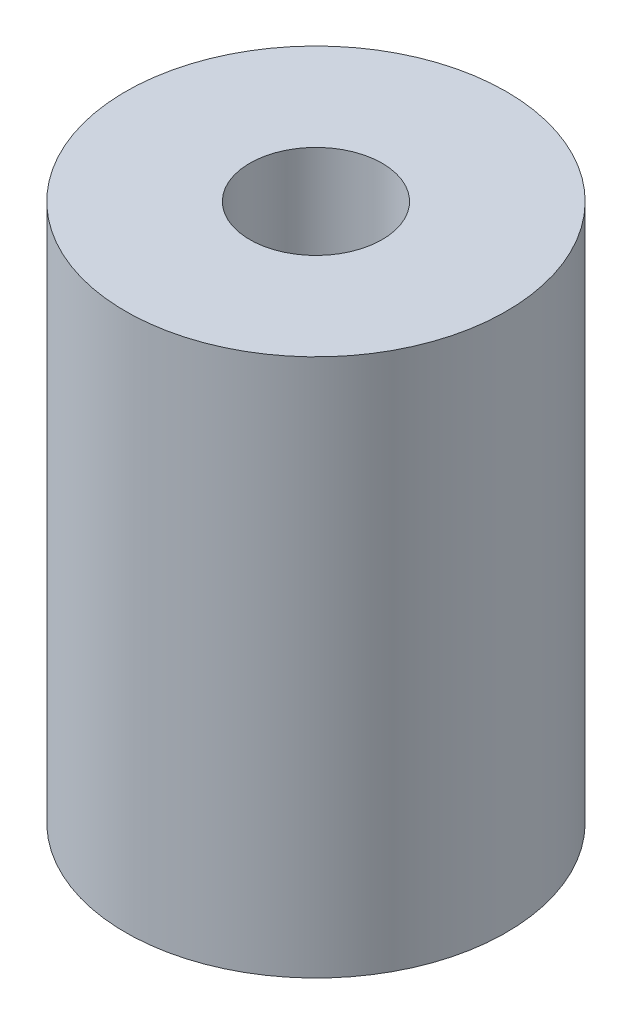
ISO-10303-21;
HEADER;
FILE_DESCRIPTION(('STEP AP214'),'2;1');
FILE_NAME('part.step','',(''),(''),'','','');
FILE_SCHEMA(('AUTOMOTIVE_DESIGN { 1 0 10303 214 1 1 1 1 }'));
ENDSEC;
DATA;
#1=APPLICATION_CONTEXT('core data for automotive mechanical design processes');
#2=APPLICATION_PROTOCOL_DEFINITION('international standard','automotive_design',2000,#1);
#3=PRODUCT_CONTEXT('',#1,'mechanical');
#4=PRODUCT('Part','Part','',(#3));
#5=PRODUCT_RELATED_PRODUCT_CATEGORY('part','',(#4));
#6=PRODUCT_DEFINITION_FORMATION('','',#4);
#7=PRODUCT_DEFINITION_CONTEXT('part definition',#1,'design');
#8=PRODUCT_DEFINITION('design','',#6,#7);
#9=PRODUCT_DEFINITION_SHAPE('','',#8);
#10=(LENGTH_UNIT() NAMED_UNIT(*) SI_UNIT(.MILLI.,.METRE.));
#11=(NAMED_UNIT(*) PLANE_ANGLE_UNIT() SI_UNIT($,.RADIAN.));
#12=(NAMED_UNIT(*) SI_UNIT($,.STERADIAN.) SOLID_ANGLE_UNIT());
#13=UNCERTAINTY_MEASURE_WITH_UNIT(LENGTH_MEASURE(1.E-05),#10,'distance_accuracy_value','');
#14=(GEOMETRIC_REPRESENTATION_CONTEXT(3) GLOBAL_UNCERTAINTY_ASSIGNED_CONTEXT((#13)) GLOBAL_UNIT_ASSIGNED_CONTEXT((#10,
#11,#12)) REPRESENTATION_CONTEXT('',''));
#15=CARTESIAN_POINT('',(0.,0.,0.));
#16=DIRECTION('',(0.,0.,1.));
#17=DIRECTION('',(1.,0.,0.));
#18=AXIS2_PLACEMENT_3D('',#15,#16,#17);
#19=CARTESIAN_POINT('',(0.,13.,0.));
#20=DIRECTION('',(0.,1.,0.));
#21=DIRECTION('',(0.,0.,1.));
#22=AXIS2_PLACEMENT_3D('',#19,#20,#21);
#23=PLANE('',#22);
#24=CARTESIAN_POINT('',(0.,13.,0.));
#25=DIRECTION('',(0.,1.,0.));
#26=DIRECTION('',(0.,0.,1.));
#27=AXIS2_PLACEMENT_3D('',#24,#25,#26);
#28=CIRCLE('',#27,4.6);
#29=CARTESIAN_POINT('',(0.,13.,-4.6));
#30=VERTEX_POINT('',#29);
#31=EDGE_CURVE('E10',#30,#30,#28,.T.);
#32=ORIENTED_EDGE('',*,*,#31,.T.);
#33=EDGE_LOOP('',(#32));
#34=FACE_BOUND('',#33,.T.);
#35=CARTESIAN_POINT('',(0.,13.,0.));
#36=DIRECTION('',(0.,1.,0.));
#37=DIRECTION('',(0.,0.,1.));
#38=AXIS2_PLACEMENT_3D('',#35,#36,#37);
#39=CIRCLE('',#38,1.6);
#40=CARTESIAN_POINT('',(0.,13.,-1.6));
#41=VERTEX_POINT('',#40);
#42=EDGE_CURVE('E54',#41,#41,#39,.T.);
#43=ORIENTED_EDGE('',*,*,#42,.F.);
#44=EDGE_LOOP('',(#43));
#45=FACE_BOUND('',#44,.T.);
#46=ADVANCED_FACE('F41',(#34,#45),#23,.T.);
#47=CARTESIAN_POINT('',(0.,0.,0.));
#48=DIRECTION('',(0.,1.,0.));
#49=DIRECTION('',(0.,0.,1.));
#50=AXIS2_PLACEMENT_3D('',#47,#48,#49);
#51=PLANE('',#50);
#52=CARTESIAN_POINT('',(0.,0.,0.));
#53=DIRECTION('',(0.,1.,0.));
#54=DIRECTION('',(0.,0.,1.));
#55=AXIS2_PLACEMENT_3D('',#52,#53,#54);
#56=CIRCLE('',#55,4.6);
#57=CARTESIAN_POINT('',(0.,0.,-4.6));
#58=VERTEX_POINT('',#57);
#59=EDGE_CURVE('E45',#58,#58,#56,.T.);
#60=ORIENTED_EDGE('',*,*,#59,.F.);
#61=EDGE_LOOP('',(#60));
#62=FACE_BOUND('',#61,.T.);
#63=CARTESIAN_POINT('',(0.,0.,0.));
#64=DIRECTION('',(0.,1.,0.));
#65=DIRECTION('',(0.,0.,1.));
#66=AXIS2_PLACEMENT_3D('',#63,#64,#65);
#67=CIRCLE('',#66,1.6);
#68=CARTESIAN_POINT('',(0.,0.,-1.6));
#69=VERTEX_POINT('',#68);
#70=EDGE_CURVE('E56',#69,#69,#67,.T.);
#71=ORIENTED_EDGE('',*,*,#70,.T.);
#72=EDGE_LOOP('',(#71));
#73=FACE_BOUND('',#72,.T.);
#74=ADVANCED_FACE('F68',(#62,#73),#51,.F.);
#75=CARTESIAN_POINT('',(0.,13.,0.));
#76=DIRECTION('',(0.,-1.,0.));
#77=DIRECTION('',(0.,0.,-1.));
#78=AXIS2_PLACEMENT_3D('',#75,#76,#77);
#79=CYLINDRICAL_SURFACE('',#78,4.6);
#80=CARTESIAN_POINT('',(0.,13.,-4.6));
#81=CARTESIAN_POINT('',(0.,12.8645833333333,-4.6));
#82=CARTESIAN_POINT('',(0.,12.7291666666667,-4.6));
#83=CARTESIAN_POINT('',(0.,12.4583333333333,-4.6));
#84=CARTESIAN_POINT('',(0.,12.3229166666667,-4.6));
#85=CARTESIAN_POINT('',(0.,12.0520833333333,-4.6));
#86=CARTESIAN_POINT('',(0.,11.9166666666667,-4.6));
#87=CARTESIAN_POINT('',(0.,11.6458333333333,-4.6));
#88=CARTESIAN_POINT('',(0.,11.5104166666667,-4.6));
#89=CARTESIAN_POINT('',(0.,11.2395833333333,-4.6));
#90=CARTESIAN_POINT('',(0.,11.1041666666667,-4.6));
#91=CARTESIAN_POINT('',(0.,10.8333333333333,-4.6));
#92=CARTESIAN_POINT('',(0.,10.6979166666667,-4.6));
#93=CARTESIAN_POINT('',(0.,10.4270833333333,-4.6));
#94=CARTESIAN_POINT('',(0.,10.2916666666667,-4.6));
#95=CARTESIAN_POINT('',(0.,10.0208333333333,-4.6));
#96=CARTESIAN_POINT('',(0.,9.88541666666667,-4.6));
#97=CARTESIAN_POINT('',(0.,9.61458333333333,-4.6));
#98=CARTESIAN_POINT('',(0.,9.47916666666667,-4.6));
#99=CARTESIAN_POINT('',(0.,9.20833333333333,-4.6));
#100=CARTESIAN_POINT('',(0.,9.07291666666666,-4.6));
#101=CARTESIAN_POINT('',(0.,8.80208333333333,-4.6));
#102=CARTESIAN_POINT('',(0.,8.66666666666667,-4.6));
#103=CARTESIAN_POINT('',(0.,8.39583333333333,-4.6));
#104=CARTESIAN_POINT('',(0.,8.26041666666667,-4.6));
#105=CARTESIAN_POINT('',(0.,7.98958333333333,-4.6));
#106=CARTESIAN_POINT('',(0.,7.85416666666667,-4.6));
#107=CARTESIAN_POINT('',(0.,7.58333333333333,-4.6));
#108=CARTESIAN_POINT('',(0.,7.44791666666667,-4.6));
#109=CARTESIAN_POINT('',(0.,7.17708333333333,-4.6));
#110=CARTESIAN_POINT('',(0.,7.04166666666667,-4.6));
#111=CARTESIAN_POINT('',(0.,6.77083333333333,-4.6));
#112=CARTESIAN_POINT('',(0.,6.63541666666667,-4.6));
#113=CARTESIAN_POINT('',(0.,6.36458333333333,-4.6));
#114=CARTESIAN_POINT('',(0.,6.22916666666667,-4.6));
#115=CARTESIAN_POINT('',(0.,5.95833333333333,-4.6));
#116=CARTESIAN_POINT('',(0.,5.82291666666667,-4.6));
#117=CARTESIAN_POINT('',(0.,5.55208333333333,-4.6));
#118=CARTESIAN_POINT('',(0.,5.41666666666667,-4.6));
#119=CARTESIAN_POINT('',(0.,5.14583333333333,-4.6));
#120=CARTESIAN_POINT('',(0.,5.01041666666667,-4.6));
#121=CARTESIAN_POINT('',(0.,4.73958333333333,-4.6));
#122=CARTESIAN_POINT('',(0.,4.60416666666667,-4.6));
#123=CARTESIAN_POINT('',(0.,4.33333333333333,-4.6));
#124=CARTESIAN_POINT('',(0.,4.19791666666667,-4.6));
#125=CARTESIAN_POINT('',(0.,3.92708333333333,-4.6));
#126=CARTESIAN_POINT('',(0.,3.79166666666667,-4.6));
#127=CARTESIAN_POINT('',(0.,3.52083333333333,-4.6));
#128=CARTESIAN_POINT('',(0.,3.38541666666667,-4.6));
#129=CARTESIAN_POINT('',(0.,3.11458333333333,-4.6));
#130=CARTESIAN_POINT('',(0.,2.97916666666667,-4.6));
#131=CARTESIAN_POINT('',(0.,2.70833333333333,-4.6));
#132=CARTESIAN_POINT('',(0.,2.57291666666667,-4.6));
#133=CARTESIAN_POINT('',(0.,2.30208333333333,-4.6));
#134=CARTESIAN_POINT('',(0.,2.16666666666667,-4.6));
#135=CARTESIAN_POINT('',(0.,1.89583333333333,-4.6));
#136=CARTESIAN_POINT('',(0.,1.76041666666667,-4.6));
#137=CARTESIAN_POINT('',(0.,1.48958333333333,-4.6));
#138=CARTESIAN_POINT('',(0.,1.35416666666667,-4.6));
#139=CARTESIAN_POINT('',(0.,1.08333333333333,-4.6));
#140=CARTESIAN_POINT('',(0.,0.947916666666667,-4.6));
#141=CARTESIAN_POINT('',(0.,0.677083333333334,-4.6));
#142=CARTESIAN_POINT('',(0.,0.541666666666667,-4.6));
#143=CARTESIAN_POINT('',(0.,0.270833333333334,-4.6));
#144=CARTESIAN_POINT('',(0.,0.135416666666667,-4.6));
#145=CARTESIAN_POINT('',(0.,0.,-4.6));
#146=B_SPLINE_CURVE_WITH_KNOTS('',3,(#80,#81,#82,#83,#84,#85,#86,#87,#88,#89,#90,#91,#92,#93,
#94,#95,#96,#97,#98,#99,#100,#101,#102,#103,#104,#105,#106,#107,#108,#109,#110,#111,#112,#113,
#114,#115,#116,#117,#118,#119,#120,#121,#122,#123,#124,#125,#126,#127,#128,#129,#130,#131,#132,
#133,#134,#135,#136,#137,#138,#139,#140,#141,#142,#143,#144,#145),.UNSPECIFIED.,.F.,.F.,(4,2,2,
2,2,2,2,2,2,2,2,2,2,2,2,2,2,2,2,2,2,2,2,2,2,2,2,2,2,2,2,2,4),(0.,0.40625,0.812500000000001,
1.21875,1.625,2.03125,2.4375,2.84375,3.25,3.65625,4.0625,4.46875,4.875,5.28125,5.6875,6.09375,
6.5,6.90625,7.3125,7.71875,8.125,8.53125,8.9375,9.34375,9.75,10.15625,10.5625,10.96875,11.375,
11.78125,12.1875,12.59375,13.),.UNSPECIFIED.);
#147=EDGE_CURVE('BSEAM43',#30,#58,#146,.T.);
#148=ORIENTED_EDGE('',*,*,#31,.F.);
#149=ORIENTED_EDGE('',*,*,#59,.T.);
#150=ORIENTED_EDGE('',*,*,#147,.T.);
#151=ORIENTED_EDGE('',*,*,#147,.F.);
#152=EDGE_LOOP('',(#148,#150,#149,#151));
#153=FACE_BOUND('',#152,.T.);
#154=ADVANCED_FACE('F43',(#153),#79,.T.);
#155=CARTESIAN_POINT('',(0.,13.,0.));
#156=DIRECTION('',(0.,-1.,0.));
#157=DIRECTION('',(0.,0.,-1.));
#158=AXIS2_PLACEMENT_3D('',#155,#156,#157);
#159=CYLINDRICAL_SURFACE('',#158,1.6);
#160=CARTESIAN_POINT('',(0.,13.,-1.6));
#161=CARTESIAN_POINT('',(0.,12.8645833333333,-1.6));
#162=CARTESIAN_POINT('',(0.,12.7291666666667,-1.6));
#163=CARTESIAN_POINT('',(0.,12.4583333333333,-1.6));
#164=CARTESIAN_POINT('',(0.,12.3229166666667,-1.6));
#165=CARTESIAN_POINT('',(0.,12.0520833333333,-1.6));
#166=CARTESIAN_POINT('',(0.,11.9166666666667,-1.6));
#167=CARTESIAN_POINT('',(0.,11.6458333333333,-1.6));
#168=CARTESIAN_POINT('',(0.,11.5104166666667,-1.6));
#169=CARTESIAN_POINT('',(0.,11.2395833333333,-1.6));
#170=CARTESIAN_POINT('',(0.,11.1041666666667,-1.6));
#171=CARTESIAN_POINT('',(0.,10.8333333333333,-1.6));
#172=CARTESIAN_POINT('',(0.,10.6979166666667,-1.6));
#173=CARTESIAN_POINT('',(0.,10.4270833333333,-1.6));
#174=CARTESIAN_POINT('',(0.,10.2916666666667,-1.6));
#175=CARTESIAN_POINT('',(0.,10.0208333333333,-1.6));
#176=CARTESIAN_POINT('',(0.,9.88541666666667,-1.6));
#177=CARTESIAN_POINT('',(0.,9.61458333333333,-1.6));
#178=CARTESIAN_POINT('',(0.,9.47916666666667,-1.6));
#179=CARTESIAN_POINT('',(0.,9.20833333333333,-1.6));
#180=CARTESIAN_POINT('',(0.,9.07291666666666,-1.6));
#181=CARTESIAN_POINT('',(0.,8.80208333333333,-1.6));
#182=CARTESIAN_POINT('',(0.,8.66666666666667,-1.6));
#183=CARTESIAN_POINT('',(0.,8.39583333333333,-1.6));
#184=CARTESIAN_POINT('',(0.,8.26041666666667,-1.6));
#185=CARTESIAN_POINT('',(0.,7.98958333333333,-1.6));
#186=CARTESIAN_POINT('',(0.,7.85416666666667,-1.6));
#187=CARTESIAN_POINT('',(0.,7.58333333333333,-1.6));
#188=CARTESIAN_POINT('',(0.,7.44791666666667,-1.6));
#189=CARTESIAN_POINT('',(0.,7.17708333333333,-1.6));
#190=CARTESIAN_POINT('',(0.,7.04166666666667,-1.6));
#191=CARTESIAN_POINT('',(0.,6.77083333333333,-1.6));
#192=CARTESIAN_POINT('',(0.,6.63541666666667,-1.6));
#193=CARTESIAN_POINT('',(0.,6.36458333333333,-1.6));
#194=CARTESIAN_POINT('',(0.,6.22916666666667,-1.6));
#195=CARTESIAN_POINT('',(0.,5.95833333333333,-1.6));
#196=CARTESIAN_POINT('',(0.,5.82291666666667,-1.6));
#197=CARTESIAN_POINT('',(0.,5.55208333333333,-1.6));
#198=CARTESIAN_POINT('',(0.,5.41666666666667,-1.6));
#199=CARTESIAN_POINT('',(0.,5.14583333333333,-1.6));
#200=CARTESIAN_POINT('',(0.,5.01041666666667,-1.6));
#201=CARTESIAN_POINT('',(0.,4.73958333333333,-1.6));
#202=CARTESIAN_POINT('',(0.,4.60416666666667,-1.6));
#203=CARTESIAN_POINT('',(0.,4.33333333333333,-1.6));
#204=CARTESIAN_POINT('',(0.,4.19791666666667,-1.6));
#205=CARTESIAN_POINT('',(0.,3.92708333333333,-1.6));
#206=CARTESIAN_POINT('',(0.,3.79166666666667,-1.6));
#207=CARTESIAN_POINT('',(0.,3.52083333333333,-1.6));
#208=CARTESIAN_POINT('',(0.,3.38541666666667,-1.6));
#209=CARTESIAN_POINT('',(0.,3.11458333333333,-1.6));
#210=CARTESIAN_POINT('',(0.,2.97916666666667,-1.6));
#211=CARTESIAN_POINT('',(0.,2.70833333333333,-1.6));
#212=CARTESIAN_POINT('',(0.,2.57291666666667,-1.6));
#213=CARTESIAN_POINT('',(0.,2.30208333333333,-1.6));
#214=CARTESIAN_POINT('',(0.,2.16666666666667,-1.6));
#215=CARTESIAN_POINT('',(0.,1.89583333333333,-1.6));
#216=CARTESIAN_POINT('',(0.,1.76041666666667,-1.6));
#217=CARTESIAN_POINT('',(0.,1.48958333333333,-1.6));
#218=CARTESIAN_POINT('',(0.,1.35416666666667,-1.6));
#219=CARTESIAN_POINT('',(0.,1.08333333333333,-1.6));
#220=CARTESIAN_POINT('',(0.,0.947916666666667,-1.6));
#221=CARTESIAN_POINT('',(0.,0.677083333333334,-1.6));
#222=CARTESIAN_POINT('',(0.,0.541666666666667,-1.6));
#223=CARTESIAN_POINT('',(0.,0.270833333333334,-1.6));
#224=CARTESIAN_POINT('',(0.,0.135416666666667,-1.6));
#225=CARTESIAN_POINT('',(0.,0.,-1.6));
#226=B_SPLINE_CURVE_WITH_KNOTS('',3,(#160,#161,#162,#163,#164,#165,#166,#167,#168,#169,#170,
#171,#172,#173,#174,#175,#176,#177,#178,#179,#180,#181,#182,#183,#184,#185,#186,#187,#188,#189,
#190,#191,#192,#193,#194,#195,#196,#197,#198,#199,#200,#201,#202,#203,#204,#205,#206,#207,#208,
#209,#210,#211,#212,#213,#214,#215,#216,#217,#218,#219,#220,#221,#222,#223,#224,#225),
.UNSPECIFIED.,.F.,.F.,(4,2,2,2,2,2,2,2,2,2,2,2,2,2,2,2,2,2,2,2,2,2,2,2,2,2,2,2,2,2,2,2,4),(0.,
0.40625,0.812500000000001,1.21875,1.625,2.03125,2.4375,2.84375,3.25,3.65625,4.0625,4.46875,
4.875,5.28125,5.6875,6.09375,6.5,6.90625,7.3125,7.71875,8.125,8.53125,8.9375,9.34375,9.75,
10.15625,10.5625,10.96875,11.375,11.78125,12.1875,12.59375,13.),.UNSPECIFIED.);
#227=EDGE_CURVE('BSEAM64',#41,#69,#226,.T.);
#228=ORIENTED_EDGE('',*,*,#42,.T.);
#229=ORIENTED_EDGE('',*,*,#70,.F.);
#230=ORIENTED_EDGE('',*,*,#227,.T.);
#231=ORIENTED_EDGE('',*,*,#227,.F.);
#232=EDGE_LOOP('',(#228,#230,#229,#231));
#233=FACE_BOUND('',#232,.T.);
#234=ADVANCED_FACE('F64',(#233),#159,.F.);
#235=CLOSED_SHELL('',(#46,#74,#154,#234));
#236=MANIFOLD_SOLID_BREP('B2',#235);
#237=ADVANCED_BREP_SHAPE_REPRESENTATION('',(#18,#236),#14);
#238=SHAPE_DEFINITION_REPRESENTATION(#9,#237);
ENDSEC;
END-ISO-10303-21;
